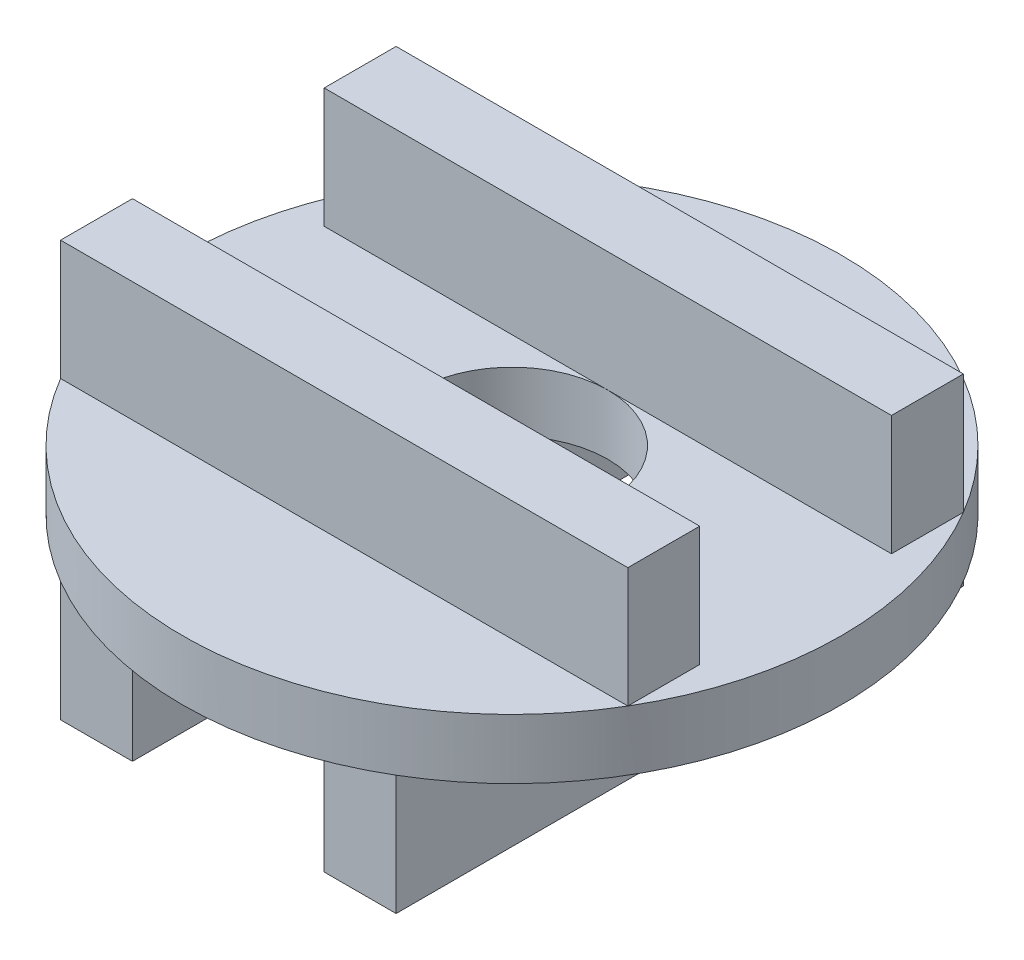
ISO-10303-21;
HEADER;
FILE_DESCRIPTION(('STEP AP214'),'2;1');
FILE_NAME('part.step','',(''),(''),'','','');
FILE_SCHEMA(('AUTOMOTIVE_DESIGN { 1 0 10303 214 1 1 1 1 }'));
ENDSEC;
DATA;
#1=APPLICATION_CONTEXT('core data for automotive mechanical design processes');
#2=APPLICATION_PROTOCOL_DEFINITION('international standard','automotive_design',2000,#1);
#3=PRODUCT_CONTEXT('',#1,'mechanical');
#4=PRODUCT('Part','Part','',(#3));
#5=PRODUCT_RELATED_PRODUCT_CATEGORY('part','',(#4));
#6=PRODUCT_DEFINITION_FORMATION('','',#4);
#7=PRODUCT_DEFINITION_CONTEXT('part definition',#1,'design');
#8=PRODUCT_DEFINITION('design','',#6,#7);
#9=PRODUCT_DEFINITION_SHAPE('','',#8);
#10=(LENGTH_UNIT() NAMED_UNIT(*) SI_UNIT(.MILLI.,.METRE.));
#11=(NAMED_UNIT(*) PLANE_ANGLE_UNIT() SI_UNIT($,.RADIAN.));
#12=(NAMED_UNIT(*) SI_UNIT($,.STERADIAN.) SOLID_ANGLE_UNIT());
#13=UNCERTAINTY_MEASURE_WITH_UNIT(LENGTH_MEASURE(1.E-05),#10,'distance_accuracy_value','');
#14=(GEOMETRIC_REPRESENTATION_CONTEXT(3) GLOBAL_UNCERTAINTY_ASSIGNED_CONTEXT((#13)) GLOBAL_UNIT_ASSIGNED_CONTEXT((#10,
#11,#12)) REPRESENTATION_CONTEXT('',''));
#15=CARTESIAN_POINT('',(0.,0.,0.));
#16=DIRECTION('',(0.,0.,1.));
#17=DIRECTION('',(1.,0.,0.));
#18=AXIS2_PLACEMENT_3D('',#15,#16,#17);
#19=CARTESIAN_POINT('',(0.,30.,-16.));
#20=DIRECTION('',(0.,0.,-1.));
#21=DIRECTION('',(-1.,0.,0.));
#22=AXIS2_PLACEMENT_3D('',#19,#20,#21);
#23=PLANE('',#22);
#24=DIRECTION('',(0.,-1.,0.));
#25=VECTOR('',#24,1.);
#26=CARTESIAN_POINT('',(-47.3392015141785,30.,-16.));
#27=LINE('',#26,#25);
#28=CARTESIAN_POINT('',(-47.3392015141785,30.,-16.));
#29=VERTEX_POINT('',#28);
#30=CARTESIAN_POINT('',(-47.3392015141785,10.,-16.));
#31=VERTEX_POINT('',#30);
#32=EDGE_CURVE('E352',#29,#31,#27,.T.);
#33=ORIENTED_EDGE('',*,*,#32,.T.);
#34=DIRECTION('',(1.,0.,0.));
#35=VECTOR('',#34,1.);
#36=CARTESIAN_POINT('',(0.,10.,-16.));
#37=LINE('',#36,#35);
#38=CARTESIAN_POINT('',(0.,10.,-16.));
#39=VERTEX_POINT('',#38);
#40=EDGE_CURVE('E387',#31,#39,#37,.T.);
#41=ORIENTED_EDGE('',*,*,#40,.T.);
#42=DIRECTION('',(1.,0.,0.));
#43=VECTOR('',#42,1.);
#44=CARTESIAN_POINT('',(0.,10.,-16.));
#45=LINE('',#44,#43);
#46=CARTESIAN_POINT('',(47.3392015141785,10.,-16.));
#47=VERTEX_POINT('',#46);
#48=EDGE_CURVE('E260',#39,#47,#45,.T.);
#49=ORIENTED_EDGE('',*,*,#48,.T.);
#50=DIRECTION('',(0.,-1.,0.));
#51=VECTOR('',#50,1.);
#52=CARTESIAN_POINT('',(47.3392015141785,30.,-16.));
#53=LINE('',#52,#51);
#54=CARTESIAN_POINT('',(47.3392015141785,30.,-16.));
#55=VERTEX_POINT('',#54);
#56=EDGE_CURVE('E79',#55,#47,#53,.T.);
#57=ORIENTED_EDGE('',*,*,#56,.F.);
#58=DIRECTION('',(1.,0.,0.));
#59=VECTOR('',#58,1.);
#60=CARTESIAN_POINT('',(0.,30.,-16.));
#61=LINE('',#60,#59);
#62=EDGE_CURVE('E331',#29,#55,#61,.T.);
#63=ORIENTED_EDGE('',*,*,#62,.F.);
#64=EDGE_LOOP('',(#33,#41,#49,#57,#63));
#65=FACE_BOUND('',#64,.T.);
#66=ADVANCED_FACE('F73',(#65),#23,.F.);
#67=CARTESIAN_POINT('',(0.,30.,16.));
#68=DIRECTION('',(0.,0.,-1.));
#69=DIRECTION('',(-1.,0.,0.));
#70=AXIS2_PLACEMENT_3D('',#67,#68,#69);
#71=PLANE('',#70);
#72=DIRECTION('',(1.,0.,0.));
#73=VECTOR('',#72,1.);
#74=CARTESIAN_POINT('',(0.,10.,16.));
#75=LINE('',#74,#73);
#76=CARTESIAN_POINT('',(-47.3392015141785,10.,16.));
#77=VERTEX_POINT('',#76);
#78=CARTESIAN_POINT('',(0.,10.,16.));
#79=VERTEX_POINT('',#78);
#80=EDGE_CURVE('E264',#77,#79,#75,.T.);
#81=ORIENTED_EDGE('',*,*,#80,.F.);
#82=DIRECTION('',(0.,-1.,0.));
#83=VECTOR('',#82,1.);
#84=CARTESIAN_POINT('',(-47.3392015141785,30.,16.));
#85=LINE('',#84,#83);
#86=CARTESIAN_POINT('',(-47.3392015141785,30.,16.));
#87=VERTEX_POINT('',#86);
#88=EDGE_CURVE('E313',#87,#77,#85,.T.);
#89=ORIENTED_EDGE('',*,*,#88,.F.);
#90=DIRECTION('',(1.,0.,0.));
#91=VECTOR('',#90,1.);
#92=CARTESIAN_POINT('',(0.,30.,16.));
#93=LINE('',#92,#91);
#94=CARTESIAN_POINT('',(47.3392015141785,30.,16.));
#95=VERTEX_POINT('',#94);
#96=EDGE_CURVE('E303',#87,#95,#93,.T.);
#97=ORIENTED_EDGE('',*,*,#96,.T.);
#98=DIRECTION('',(0.,-1.,0.));
#99=VECTOR('',#98,1.);
#100=CARTESIAN_POINT('',(47.3392015141785,30.,16.));
#101=LINE('',#100,#99);
#102=CARTESIAN_POINT('',(47.3392015141785,10.,16.));
#103=VERTEX_POINT('',#102);
#104=EDGE_CURVE('E235',#95,#103,#101,.T.);
#105=ORIENTED_EDGE('',*,*,#104,.T.);
#106=DIRECTION('',(1.,0.,0.));
#107=VECTOR('',#106,1.);
#108=CARTESIAN_POINT('',(0.,10.,16.));
#109=LINE('',#108,#107);
#110=EDGE_CURVE('E246',#79,#103,#109,.T.);
#111=ORIENTED_EDGE('',*,*,#110,.F.);
#112=EDGE_LOOP('',(#81,#89,#97,#105,#111));
#113=FACE_BOUND('',#112,.T.);
#114=ADVANCED_FACE('F408',(#113),#71,.T.);
#115=CARTESIAN_POINT('',(0.,0.,0.));
#116=DIRECTION('',(0.,1.,0.));
#117=DIRECTION('',(0.,0.,1.));
#118=AXIS2_PLACEMENT_3D('',#115,#116,#117);
#119=PLANE('',#118);
#120=CARTESIAN_POINT('',(0.,0.,0.));
#121=DIRECTION('',(0.,1.,0.));
#122=DIRECTION('',(0.,0.,1.));
#123=AXIS2_PLACEMENT_3D('',#120,#121,#122);
#124=CIRCLE('',#123,16.);
#125=CARTESIAN_POINT('',(16.,0.,0.));
#126=VERTEX_POINT('',#125);
#127=CARTESIAN_POINT('',(-16.,0.,0.));
#128=VERTEX_POINT('',#127);
#129=EDGE_CURVE('E253',#126,#128,#124,.T.);
#130=ORIENTED_EDGE('',*,*,#129,.T.);
#131=DIRECTION('',(0.,0.,-1.));
#132=VECTOR('',#131,1.);
#133=CARTESIAN_POINT('',(-16.,0.,0.));
#134=LINE('',#133,#132);
#135=CARTESIAN_POINT('',(-16.,0.,-47.3392015141785));
#136=VERTEX_POINT('',#135);
#137=EDGE_CURVE('E263',#128,#136,#134,.T.);
#138=ORIENTED_EDGE('',*,*,#137,.T.);
#139=DIRECTION('',(-1.,0.,0.));
#140=VECTOR('',#139,1.);
#141=CARTESIAN_POINT('',(0.,0.,-47.3392015141785));
#142=LINE('',#141,#140);
#143=CARTESIAN_POINT('',(-28.,0.,-47.3392015141785));
#144=VERTEX_POINT('',#143);
#145=EDGE_CURVE('E284',#136,#144,#142,.T.);
#146=ORIENTED_EDGE('',*,*,#145,.T.);
#147=CARTESIAN_POINT('',(0.,0.,0.));
#148=DIRECTION('',(0.,1.,0.));
#149=DIRECTION('',(0.,0.,1.));
#150=AXIS2_PLACEMENT_3D('',#147,#148,#149);
#151=CIRCLE('',#150,55.);
#152=CARTESIAN_POINT('',(28.,0.,-47.3392015141785));
#153=VERTEX_POINT('',#152);
#154=EDGE_CURVE('E376',#153,#144,#151,.T.);
#155=ORIENTED_EDGE('',*,*,#154,.F.);
#156=DIRECTION('',(1.,0.,0.));
#157=VECTOR('',#156,1.);
#158=CARTESIAN_POINT('',(0.,0.,-47.3392015141785));
#159=LINE('',#158,#157);
#160=CARTESIAN_POINT('',(16.,0.,-47.3392015141785));
#161=VERTEX_POINT('',#160);
#162=EDGE_CURVE('E231',#161,#153,#159,.T.);
#163=ORIENTED_EDGE('',*,*,#162,.F.);
#164=DIRECTION('',(0.,0.,-1.));
#165=VECTOR('',#164,1.);
#166=CARTESIAN_POINT('',(16.,0.,0.));
#167=LINE('',#166,#165);
#168=EDGE_CURVE('E85',#126,#161,#167,.T.);
#169=ORIENTED_EDGE('',*,*,#168,.F.);
#170=EDGE_LOOP('',(#130,#138,#146,#155,#163,#169));
#171=FACE_BOUND('',#170,.T.);
#172=ADVANCED_FACE('F372',(#171),#119,.F.);
#173=EDGE_CURVE('E250',#128,#126,#124,.T.);
#174=ORIENTED_EDGE('',*,*,#173,.T.);
#175=CARTESIAN_POINT('',(16.,0.,47.3392015141785));
#176=VERTEX_POINT('',#175);
#177=EDGE_CURVE('E330',#176,#126,#167,.T.);
#178=ORIENTED_EDGE('',*,*,#177,.F.);
#179=DIRECTION('',(1.,0.,0.));
#180=VECTOR('',#179,1.);
#181=CARTESIAN_POINT('',(0.,0.,47.3392015141785));
#182=LINE('',#181,#180);
#183=CARTESIAN_POINT('',(28.,0.,47.3392015141785));
#184=VERTEX_POINT('',#183);
#185=EDGE_CURVE('E320',#176,#184,#182,.T.);
#186=ORIENTED_EDGE('',*,*,#185,.T.);
#187=CARTESIAN_POINT('',(0.,0.,0.));
#188=DIRECTION('',(0.,1.,0.));
#189=DIRECTION('',(0.,0.,1.));
#190=AXIS2_PLACEMENT_3D('',#187,#188,#189);
#191=CIRCLE('',#190,55.);
#192=CARTESIAN_POINT('',(-28.,0.,47.3392015141785));
#193=VERTEX_POINT('',#192);
#194=EDGE_CURVE('E211',#193,#184,#191,.T.);
#195=ORIENTED_EDGE('',*,*,#194,.F.);
#196=DIRECTION('',(-1.,0.,0.));
#197=VECTOR('',#196,1.);
#198=CARTESIAN_POINT('',(0.,0.,47.3392015141785));
#199=LINE('',#198,#197);
#200=CARTESIAN_POINT('',(-16.,0.,47.3392015141785));
#201=VERTEX_POINT('',#200);
#202=EDGE_CURVE('E271',#201,#193,#199,.T.);
#203=ORIENTED_EDGE('',*,*,#202,.F.);
#204=EDGE_CURVE('E285',#201,#128,#134,.T.);
#205=ORIENTED_EDGE('',*,*,#204,.T.);
#206=EDGE_LOOP('',(#174,#178,#186,#195,#203,#205));
#207=FACE_BOUND('',#206,.T.);
#208=ADVANCED_FACE('F437',(#207),#119,.F.);
#209=DIRECTION('',(0.,0.,1.));
#210=VECTOR('',#209,1.);
#211=CARTESIAN_POINT('',(28.,0.,0.));
#212=LINE('',#211,#210);
#213=EDGE_CURVE('E12',#153,#184,#212,.T.);
#214=ORIENTED_EDGE('',*,*,#213,.F.);
#215=CARTESIAN_POINT('',(0.,0.,0.));
#216=DIRECTION('',(0.,1.,0.));
#217=DIRECTION('',(0.,0.,1.));
#218=AXIS2_PLACEMENT_3D('',#215,#216,#217);
#219=CIRCLE('',#218,55.);
#220=EDGE_CURVE('E262',#184,#153,#219,.T.);
#221=ORIENTED_EDGE('',*,*,#220,.F.);
#222=EDGE_LOOP('',(#214,#221));
#223=FACE_BOUND('',#222,.T.);
#224=ADVANCED_FACE('F434',(#223),#119,.F.);
#225=CARTESIAN_POINT('',(0.,0.,0.));
#226=DIRECTION('',(0.,1.,0.));
#227=DIRECTION('',(0.,0.,1.));
#228=AXIS2_PLACEMENT_3D('',#225,#226,#227);
#229=CIRCLE('',#228,55.);
#230=EDGE_CURVE('E382',#144,#193,#229,.T.);
#231=ORIENTED_EDGE('',*,*,#230,.F.);
#232=DIRECTION('',(0.,0.,1.));
#233=VECTOR('',#232,1.);
#234=CARTESIAN_POINT('',(-28.,0.,0.));
#235=LINE('',#234,#233);
#236=EDGE_CURVE('E289',#144,#193,#235,.T.);
#237=ORIENTED_EDGE('',*,*,#236,.T.);
#238=EDGE_LOOP('',(#231,#237));
#239=FACE_BOUND('',#238,.T.);
#240=ADVANCED_FACE('F433',(#239),#119,.F.);
#241=CARTESIAN_POINT('',(47.3392015141785,30.,0.));
#242=DIRECTION('',(-1.,0.,0.));
#243=DIRECTION('',(0.,0.,1.));
#244=AXIS2_PLACEMENT_3D('',#241,#242,#243);
#245=PLANE('',#244);
#246=ORIENTED_EDGE('',*,*,#56,.T.);
#247=DIRECTION('',(0.,0.,-1.));
#248=VECTOR('',#247,1.);
#249=CARTESIAN_POINT('',(47.3392015141785,10.,0.));
#250=LINE('',#249,#248);
#251=CARTESIAN_POINT('',(47.3392015141785,10.,-28.));
#252=VERTEX_POINT('',#251);
#253=EDGE_CURVE('E244',#47,#252,#250,.T.);
#254=ORIENTED_EDGE('',*,*,#253,.T.);
#255=DIRECTION('',(0.,-1.,0.));
#256=VECTOR('',#255,1.);
#257=CARTESIAN_POINT('',(47.3392015141785,30.,-28.));
#258=LINE('',#257,#256);
#259=CARTESIAN_POINT('',(47.3392015141785,30.,-28.));
#260=VERTEX_POINT('',#259);
#261=EDGE_CURVE('E351',#260,#252,#258,.T.);
#262=ORIENTED_EDGE('',*,*,#261,.F.);
#263=DIRECTION('',(0.,0.,-1.));
#264=VECTOR('',#263,1.);
#265=CARTESIAN_POINT('',(47.3392015141785,30.,0.));
#266=LINE('',#265,#264);
#267=EDGE_CURVE('E342',#55,#260,#266,.T.);
#268=ORIENTED_EDGE('',*,*,#267,.F.);
#269=EDGE_LOOP('',(#246,#254,#262,#268));
#270=FACE_BOUND('',#269,.T.);
#271=ADVANCED_FACE('F426',(#270),#245,.F.);
#272=CARTESIAN_POINT('',(0.,30.,-28.));
#273=DIRECTION('',(0.,0.,1.));
#274=DIRECTION('',(1.,0.,0.));
#275=AXIS2_PLACEMENT_3D('',#272,#273,#274);
#276=PLANE('',#275);
#277=ORIENTED_EDGE('',*,*,#261,.T.);
#278=DIRECTION('',(-1.,0.,0.));
#279=VECTOR('',#278,1.);
#280=CARTESIAN_POINT('',(0.,10.,-28.));
#281=LINE('',#280,#279);
#282=CARTESIAN_POINT('',(-47.3392015141785,10.,-28.));
#283=VERTEX_POINT('',#282);
#284=EDGE_CURVE('E93',#252,#283,#281,.T.);
#285=ORIENTED_EDGE('',*,*,#284,.T.);
#286=DIRECTION('',(0.,-1.,0.));
#287=VECTOR('',#286,1.);
#288=CARTESIAN_POINT('',(-47.3392015141785,30.,-28.));
#289=LINE('',#288,#287);
#290=CARTESIAN_POINT('',(-47.3392015141785,30.,-28.));
#291=VERTEX_POINT('',#290);
#292=EDGE_CURVE('E354',#291,#283,#289,.T.);
#293=ORIENTED_EDGE('',*,*,#292,.F.);
#294=DIRECTION('',(-1.,0.,0.));
#295=VECTOR('',#294,1.);
#296=CARTESIAN_POINT('',(0.,30.,-28.));
#297=LINE('',#296,#295);
#298=EDGE_CURVE('E350',#260,#291,#297,.T.);
#299=ORIENTED_EDGE('',*,*,#298,.F.);
#300=EDGE_LOOP('',(#277,#285,#293,#299));
#301=FACE_BOUND('',#300,.T.);
#302=ADVANCED_FACE('F424',(#301),#276,.F.);
#303=CARTESIAN_POINT('',(-47.3392015141785,30.,0.));
#304=DIRECTION('',(1.,0.,0.));
#305=DIRECTION('',(0.,0.,-1.));
#306=AXIS2_PLACEMENT_3D('',#303,#304,#305);
#307=PLANE('',#306);
#308=ORIENTED_EDGE('',*,*,#292,.T.);
#309=DIRECTION('',(0.,0.,1.));
#310=VECTOR('',#309,1.);
#311=CARTESIAN_POINT('',(-47.3392015141785,10.,0.));
#312=LINE('',#311,#310);
#313=EDGE_CURVE('E98',#283,#31,#312,.T.);
#314=ORIENTED_EDGE('',*,*,#313,.T.);
#315=ORIENTED_EDGE('',*,*,#32,.F.);
#316=DIRECTION('',(0.,0.,1.));
#317=VECTOR('',#316,1.);
#318=CARTESIAN_POINT('',(-47.3392015141785,30.,0.));
#319=LINE('',#318,#317);
#320=EDGE_CURVE('E349',#291,#29,#319,.T.);
#321=ORIENTED_EDGE('',*,*,#320,.F.);
#322=EDGE_LOOP('',(#308,#314,#315,#321));
#323=FACE_BOUND('',#322,.T.);
#324=ADVANCED_FACE('F423',(#323),#307,.F.);
#325=CARTESIAN_POINT('',(0.,30.,0.));
#326=DIRECTION('',(0.,1.,0.));
#327=DIRECTION('',(0.,0.,1.));
#328=AXIS2_PLACEMENT_3D('',#325,#326,#327);
#329=PLANE('',#328);
#330=ORIENTED_EDGE('',*,*,#62,.T.);
#331=ORIENTED_EDGE('',*,*,#267,.T.);
#332=ORIENTED_EDGE('',*,*,#298,.T.);
#333=ORIENTED_EDGE('',*,*,#320,.T.);
#334=EDGE_LOOP('',(#330,#331,#332,#333));
#335=FACE_BOUND('',#334,.T.);
#336=ADVANCED_FACE('F421',(#335),#329,.T.);
#337=CARTESIAN_POINT('',(28.,-20.,0.));
#338=DIRECTION('',(-1.,0.,0.));
#339=DIRECTION('',(0.,0.,1.));
#340=AXIS2_PLACEMENT_3D('',#337,#338,#339);
#341=PLANE('',#340);
#342=DIRECTION('',(0.,1.,0.));
#343=VECTOR('',#342,1.);
#344=CARTESIAN_POINT('',(28.,-20.,-47.3392015141785));
#345=LINE('',#344,#343);
#346=CARTESIAN_POINT('',(28.,-20.,-47.3392015141785));
#347=VERTEX_POINT('',#346);
#348=EDGE_CURVE('E323',#347,#153,#345,.T.);
#349=ORIENTED_EDGE('',*,*,#348,.T.);
#350=ORIENTED_EDGE('',*,*,#213,.T.);
#351=DIRECTION('',(0.,1.,0.));
#352=VECTOR('',#351,1.);
#353=CARTESIAN_POINT('',(28.,-20.,47.3392015141785));
#354=LINE('',#353,#352);
#355=CARTESIAN_POINT('',(28.,-20.,47.3392015141785));
#356=VERTEX_POINT('',#355);
#357=EDGE_CURVE('E332',#356,#184,#354,.T.);
#358=ORIENTED_EDGE('',*,*,#357,.F.);
#359=DIRECTION('',(0.,0.,1.));
#360=VECTOR('',#359,1.);
#361=CARTESIAN_POINT('',(28.,-20.,0.));
#362=LINE('',#361,#360);
#363=EDGE_CURVE('E314',#347,#356,#362,.T.);
#364=ORIENTED_EDGE('',*,*,#363,.F.);
#365=EDGE_LOOP('',(#349,#350,#358,#364));
#366=FACE_BOUND('',#365,.T.);
#367=ADVANCED_FACE('F445',(#366),#341,.F.);
#368=CARTESIAN_POINT('',(0.,-20.,47.3392015141785));
#369=DIRECTION('',(0.,0.,1.));
#370=DIRECTION('',(1.,0.,0.));
#371=AXIS2_PLACEMENT_3D('',#368,#369,#370);
#372=PLANE('',#371);
#373=ORIENTED_EDGE('',*,*,#185,.F.);
#374=DIRECTION('',(0.,1.,0.));
#375=VECTOR('',#374,1.);
#376=CARTESIAN_POINT('',(16.,-20.,47.3392015141785));
#377=LINE('',#376,#375);
#378=CARTESIAN_POINT('',(16.,-20.,47.3392015141785));
#379=VERTEX_POINT('',#378);
#380=EDGE_CURVE('E333',#379,#176,#377,.T.);
#381=ORIENTED_EDGE('',*,*,#380,.F.);
#382=DIRECTION('',(1.,0.,0.));
#383=VECTOR('',#382,1.);
#384=CARTESIAN_POINT('',(0.,-20.,47.3392015141785));
#385=LINE('',#384,#383);
#386=EDGE_CURVE('E321',#379,#356,#385,.T.);
#387=ORIENTED_EDGE('',*,*,#386,.T.);
#388=ORIENTED_EDGE('',*,*,#357,.T.);
#389=EDGE_LOOP('',(#373,#381,#387,#388));
#390=FACE_BOUND('',#389,.T.);
#391=ADVANCED_FACE('F443',(#390),#372,.T.);
#392=CARTESIAN_POINT('',(16.,-20.,0.));
#393=DIRECTION('',(1.,0.,0.));
#394=DIRECTION('',(0.,0.,-1.));
#395=AXIS2_PLACEMENT_3D('',#392,#393,#394);
#396=PLANE('',#395);
#397=ORIENTED_EDGE('',*,*,#177,.T.);
#398=ORIENTED_EDGE('',*,*,#168,.T.);
#399=DIRECTION('',(0.,1.,0.));
#400=VECTOR('',#399,1.);
#401=CARTESIAN_POINT('',(16.,-20.,-47.3392015141785));
#402=LINE('',#401,#400);
#403=CARTESIAN_POINT('',(16.,-20.,-47.3392015141785));
#404=VERTEX_POINT('',#403);
#405=EDGE_CURVE('E339',#404,#161,#402,.T.);
#406=ORIENTED_EDGE('',*,*,#405,.F.);
#407=DIRECTION('',(0.,0.,-1.));
#408=VECTOR('',#407,1.);
#409=CARTESIAN_POINT('',(16.,-20.,0.));
#410=LINE('',#409,#408);
#411=EDGE_CURVE('E317',#379,#404,#410,.T.);
#412=ORIENTED_EDGE('',*,*,#411,.F.);
#413=ORIENTED_EDGE('',*,*,#380,.T.);
#414=EDGE_LOOP('',(#397,#398,#406,#412,#413));
#415=FACE_BOUND('',#414,.T.);
#416=ADVANCED_FACE('F361',(#415),#396,.F.);
#417=CARTESIAN_POINT('',(0.,-20.,-47.3392015141785));
#418=DIRECTION('',(0.,0.,1.));
#419=DIRECTION('',(1.,0.,0.));
#420=AXIS2_PLACEMENT_3D('',#417,#418,#419);
#421=PLANE('',#420);
#422=ORIENTED_EDGE('',*,*,#162,.T.);
#423=ORIENTED_EDGE('',*,*,#348,.F.);
#424=DIRECTION('',(1.,0.,0.));
#425=VECTOR('',#424,1.);
#426=CARTESIAN_POINT('',(0.,-20.,-47.3392015141785));
#427=LINE('',#426,#425);
#428=EDGE_CURVE('E316',#404,#347,#427,.T.);
#429=ORIENTED_EDGE('',*,*,#428,.F.);
#430=ORIENTED_EDGE('',*,*,#405,.T.);
#431=EDGE_LOOP('',(#422,#423,#429,#430));
#432=FACE_BOUND('',#431,.T.);
#433=ADVANCED_FACE('F371',(#432),#421,.F.);
#434=CARTESIAN_POINT('',(0.,-20.,0.));
#435=DIRECTION('',(0.,1.,0.));
#436=DIRECTION('',(0.,0.,1.));
#437=AXIS2_PLACEMENT_3D('',#434,#435,#436);
#438=PLANE('',#437);
#439=ORIENTED_EDGE('',*,*,#363,.T.);
#440=ORIENTED_EDGE('',*,*,#386,.F.);
#441=ORIENTED_EDGE('',*,*,#411,.T.);
#442=ORIENTED_EDGE('',*,*,#428,.T.);
#443=EDGE_LOOP('',(#439,#440,#441,#442));
#444=FACE_BOUND('',#443,.T.);
#445=ADVANCED_FACE('F446',(#444),#438,.F.);
#446=CARTESIAN_POINT('',(0.,30.,28.));
#447=DIRECTION('',(0.,0.,1.));
#448=DIRECTION('',(1.,0.,0.));
#449=AXIS2_PLACEMENT_3D('',#446,#447,#448);
#450=PLANE('',#449);
#451=DIRECTION('',(-1.,0.,0.));
#452=VECTOR('',#451,1.);
#453=CARTESIAN_POINT('',(0.,10.,28.));
#454=LINE('',#453,#452);
#455=CARTESIAN_POINT('',(47.3392015141785,10.,28.));
#456=VERTEX_POINT('',#455);
#457=CARTESIAN_POINT('',(-47.3392015141785,10.,28.));
#458=VERTEX_POINT('',#457);
#459=EDGE_CURVE('E206',#456,#458,#454,.T.);
#460=ORIENTED_EDGE('',*,*,#459,.F.);
#461=DIRECTION('',(0.,-1.,0.));
#462=VECTOR('',#461,1.);
#463=CARTESIAN_POINT('',(47.3392015141785,30.,28.));
#464=LINE('',#463,#462);
#465=CARTESIAN_POINT('',(47.3392015141785,30.,28.));
#466=VERTEX_POINT('',#465);
#467=EDGE_CURVE('E217',#466,#456,#464,.T.);
#468=ORIENTED_EDGE('',*,*,#467,.F.);
#469=DIRECTION('',(-1.,0.,0.));
#470=VECTOR('',#469,1.);
#471=CARTESIAN_POINT('',(0.,30.,28.));
#472=LINE('',#471,#470);
#473=CARTESIAN_POINT('',(-47.3392015141785,30.,28.));
#474=VERTEX_POINT('',#473);
#475=EDGE_CURVE('E294',#466,#474,#472,.T.);
#476=ORIENTED_EDGE('',*,*,#475,.T.);
#477=DIRECTION('',(0.,-1.,0.));
#478=VECTOR('',#477,1.);
#479=CARTESIAN_POINT('',(-47.3392015141785,30.,28.));
#480=LINE('',#479,#478);
#481=EDGE_CURVE('E219',#474,#458,#480,.T.);
#482=ORIENTED_EDGE('',*,*,#481,.T.);
#483=EDGE_LOOP('',(#460,#468,#476,#482));
#484=FACE_BOUND('',#483,.T.);
#485=ADVANCED_FACE('F216',(#484),#450,.T.);
#486=CARTESIAN_POINT('',(47.3392015141785,30.,0.));
#487=DIRECTION('',(1.,0.,0.));
#488=DIRECTION('',(0.,0.,-1.));
#489=AXIS2_PLACEMENT_3D('',#486,#487,#488);
#490=PLANE('',#489);
#491=DIRECTION('',(0.,0.,1.));
#492=VECTOR('',#491,1.);
#493=CARTESIAN_POINT('',(47.3392015141785,10.,0.));
#494=LINE('',#493,#492);
#495=EDGE_CURVE('E229',#103,#456,#494,.T.);
#496=ORIENTED_EDGE('',*,*,#495,.F.);
#497=ORIENTED_EDGE('',*,*,#104,.F.);
#498=DIRECTION('',(0.,0.,1.));
#499=VECTOR('',#498,1.);
#500=CARTESIAN_POINT('',(47.3392015141785,30.,0.));
#501=LINE('',#500,#499);
#502=EDGE_CURVE('E234',#95,#466,#501,.T.);
#503=ORIENTED_EDGE('',*,*,#502,.T.);
#504=ORIENTED_EDGE('',*,*,#467,.T.);
#505=EDGE_LOOP('',(#496,#497,#503,#504));
#506=FACE_BOUND('',#505,.T.);
#507=ADVANCED_FACE('F227',(#506),#490,.T.);
#508=CARTESIAN_POINT('',(-47.3392015141785,30.,0.));
#509=DIRECTION('',(-1.,0.,0.));
#510=DIRECTION('',(0.,0.,1.));
#511=AXIS2_PLACEMENT_3D('',#508,#509,#510);
#512=PLANE('',#511);
#513=DIRECTION('',(0.,0.,-1.));
#514=VECTOR('',#513,1.);
#515=CARTESIAN_POINT('',(-47.3392015141785,10.,0.));
#516=LINE('',#515,#514);
#517=EDGE_CURVE('E394',#458,#77,#516,.T.);
#518=ORIENTED_EDGE('',*,*,#517,.F.);
#519=ORIENTED_EDGE('',*,*,#481,.F.);
#520=DIRECTION('',(0.,0.,-1.));
#521=VECTOR('',#520,1.);
#522=CARTESIAN_POINT('',(-47.3392015141785,30.,0.));
#523=LINE('',#522,#521);
#524=EDGE_CURVE('E307',#474,#87,#523,.T.);
#525=ORIENTED_EDGE('',*,*,#524,.T.);
#526=ORIENTED_EDGE('',*,*,#88,.T.);
#527=EDGE_LOOP('',(#518,#519,#525,#526));
#528=FACE_BOUND('',#527,.T.);
#529=ADVANCED_FACE('F462',(#528),#512,.T.);
#530=CARTESIAN_POINT('',(0.,30.,0.));
#531=DIRECTION('',(0.,1.,0.));
#532=DIRECTION('',(0.,0.,1.));
#533=AXIS2_PLACEMENT_3D('',#530,#531,#532);
#534=PLANE('',#533);
#535=ORIENTED_EDGE('',*,*,#475,.F.);
#536=ORIENTED_EDGE('',*,*,#502,.F.);
#537=ORIENTED_EDGE('',*,*,#96,.F.);
#538=ORIENTED_EDGE('',*,*,#524,.F.);
#539=EDGE_LOOP('',(#535,#536,#537,#538));
#540=FACE_BOUND('',#539,.T.);
#541=ADVANCED_FACE('F463',(#540),#534,.T.);
#542=CARTESIAN_POINT('',(-16.,-20.,0.));
#543=DIRECTION('',(1.,0.,0.));
#544=DIRECTION('',(0.,0.,-1.));
#545=AXIS2_PLACEMENT_3D('',#542,#543,#544);
#546=PLANE('',#545);
#547=ORIENTED_EDGE('',*,*,#204,.F.);
#548=DIRECTION('',(0.,1.,0.));
#549=VECTOR('',#548,1.);
#550=CARTESIAN_POINT('',(-16.,-20.,47.3392015141785));
#551=LINE('',#550,#549);
#552=CARTESIAN_POINT('',(-16.,-20.,47.3392015141785));
#553=VERTEX_POINT('',#552);
#554=EDGE_CURVE('E292',#553,#201,#551,.T.);
#555=ORIENTED_EDGE('',*,*,#554,.F.);
#556=DIRECTION('',(0.,0.,-1.));
#557=VECTOR('',#556,1.);
#558=CARTESIAN_POINT('',(-16.,-20.,0.));
#559=LINE('',#558,#557);
#560=CARTESIAN_POINT('',(-16.,-20.,-47.3392015141785));
#561=VERTEX_POINT('',#560);
#562=EDGE_CURVE('E270',#553,#561,#559,.T.);
#563=ORIENTED_EDGE('',*,*,#562,.T.);
#564=DIRECTION('',(0.,1.,0.));
#565=VECTOR('',#564,1.);
#566=CARTESIAN_POINT('',(-16.,-20.,-47.3392015141785));
#567=LINE('',#566,#565);
#568=EDGE_CURVE('E276',#561,#136,#567,.T.);
#569=ORIENTED_EDGE('',*,*,#568,.T.);
#570=ORIENTED_EDGE('',*,*,#137,.F.);
#571=EDGE_LOOP('',(#547,#555,#563,#569,#570));
#572=FACE_BOUND('',#571,.T.);
#573=ADVANCED_FACE('F468',(#572),#546,.T.);
#574=CARTESIAN_POINT('',(0.,-20.,47.3392015141785));
#575=DIRECTION('',(0.,0.,-1.));
#576=DIRECTION('',(-1.,0.,0.));
#577=AXIS2_PLACEMENT_3D('',#574,#575,#576);
#578=PLANE('',#577);
#579=ORIENTED_EDGE('',*,*,#202,.T.);
#580=DIRECTION('',(0.,1.,0.));
#581=VECTOR('',#580,1.);
#582=CARTESIAN_POINT('',(-28.,-20.,47.3392015141785));
#583=LINE('',#582,#581);
#584=CARTESIAN_POINT('',(-28.,-20.,47.3392015141785));
#585=VERTEX_POINT('',#584);
#586=EDGE_CURVE('E293',#585,#193,#583,.T.);
#587=ORIENTED_EDGE('',*,*,#586,.F.);
#588=DIRECTION('',(-1.,0.,0.));
#589=VECTOR('',#588,1.);
#590=CARTESIAN_POINT('',(0.,-20.,47.3392015141785));
#591=LINE('',#590,#589);
#592=EDGE_CURVE('E280',#553,#585,#591,.T.);
#593=ORIENTED_EDGE('',*,*,#592,.F.);
#594=ORIENTED_EDGE('',*,*,#554,.T.);
#595=EDGE_LOOP('',(#579,#587,#593,#594));
#596=FACE_BOUND('',#595,.T.);
#597=ADVANCED_FACE('F471',(#596),#578,.F.);
#598=CARTESIAN_POINT('',(-28.,-20.,0.));
#599=DIRECTION('',(-1.,0.,0.));
#600=DIRECTION('',(0.,0.,1.));
#601=AXIS2_PLACEMENT_3D('',#598,#599,#600);
#602=PLANE('',#601);
#603=ORIENTED_EDGE('',*,*,#236,.F.);
#604=DIRECTION('',(0.,1.,0.));
#605=VECTOR('',#604,1.);
#606=CARTESIAN_POINT('',(-28.,-20.,-47.3392015141785));
#607=LINE('',#606,#605);
#608=CARTESIAN_POINT('',(-28.,-20.,-47.3392015141785));
#609=VERTEX_POINT('',#608);
#610=EDGE_CURVE('E299',#609,#144,#607,.T.);
#611=ORIENTED_EDGE('',*,*,#610,.F.);
#612=DIRECTION('',(0.,0.,1.));
#613=VECTOR('',#612,1.);
#614=CARTESIAN_POINT('',(-28.,-20.,0.));
#615=LINE('',#614,#613);
#616=EDGE_CURVE('E273',#609,#585,#615,.T.);
#617=ORIENTED_EDGE('',*,*,#616,.T.);
#618=ORIENTED_EDGE('',*,*,#586,.T.);
#619=EDGE_LOOP('',(#603,#611,#617,#618));
#620=FACE_BOUND('',#619,.T.);
#621=ADVANCED_FACE('F479',(#620),#602,.T.);
#622=CARTESIAN_POINT('',(0.,-20.,-47.3392015141785));
#623=DIRECTION('',(0.,0.,-1.));
#624=DIRECTION('',(-1.,0.,0.));
#625=AXIS2_PLACEMENT_3D('',#622,#623,#624);
#626=PLANE('',#625);
#627=ORIENTED_EDGE('',*,*,#145,.F.);
#628=ORIENTED_EDGE('',*,*,#568,.F.);
#629=DIRECTION('',(-1.,0.,0.));
#630=VECTOR('',#629,1.);
#631=CARTESIAN_POINT('',(0.,-20.,-47.3392015141785));
#632=LINE('',#631,#630);
#633=EDGE_CURVE('E269',#561,#609,#632,.T.);
#634=ORIENTED_EDGE('',*,*,#633,.T.);
#635=ORIENTED_EDGE('',*,*,#610,.T.);
#636=EDGE_LOOP('',(#627,#628,#634,#635));
#637=FACE_BOUND('',#636,.T.);
#638=ADVANCED_FACE('F474',(#637),#626,.T.);
#639=CARTESIAN_POINT('',(0.,-20.,0.));
#640=DIRECTION('',(0.,1.,0.));
#641=DIRECTION('',(0.,0.,1.));
#642=AXIS2_PLACEMENT_3D('',#639,#640,#641);
#643=PLANE('',#642);
#644=ORIENTED_EDGE('',*,*,#562,.F.);
#645=ORIENTED_EDGE('',*,*,#592,.T.);
#646=ORIENTED_EDGE('',*,*,#616,.F.);
#647=ORIENTED_EDGE('',*,*,#633,.F.);
#648=EDGE_LOOP('',(#644,#645,#646,#647));
#649=FACE_BOUND('',#648,.T.);
#650=ADVANCED_FACE('F476',(#649),#643,.F.);
#651=CARTESIAN_POINT('',(0.,10.,0.));
#652=DIRECTION('',(0.,-1.,0.));
#653=DIRECTION('',(0.,0.,-1.));
#654=AXIS2_PLACEMENT_3D('',#651,#652,#653);
#655=CYLINDRICAL_SURFACE('',#654,55.);
#656=ORIENTED_EDGE('',*,*,#230,.T.);
#657=ORIENTED_EDGE('',*,*,#194,.T.);
#658=ORIENTED_EDGE('',*,*,#220,.T.);
#659=ORIENTED_EDGE('',*,*,#154,.T.);
#660=EDGE_LOOP('',(#656,#657,#658,#659));
#661=FACE_BOUND('',#660,.T.);
#662=CARTESIAN_POINT('',(0.,10.,0.));
#663=DIRECTION('',(0.,1.,0.));
#664=DIRECTION('',(0.,0.,1.));
#665=AXIS2_PLACEMENT_3D('',#662,#663,#664);
#666=CIRCLE('',#665,55.);
#667=EDGE_CURVE('E201',#458,#456,#666,.T.);
#668=ORIENTED_EDGE('',*,*,#667,.F.);
#669=CARTESIAN_POINT('',(0.,10.,0.));
#670=DIRECTION('',(0.,1.,0.));
#671=DIRECTION('',(0.,0.,1.));
#672=AXIS2_PLACEMENT_3D('',#669,#670,#671);
#673=CIRCLE('',#672,55.);
#674=EDGE_CURVE('E389',#283,#458,#673,.T.);
#675=ORIENTED_EDGE('',*,*,#674,.F.);
#676=CARTESIAN_POINT('',(0.,10.,0.));
#677=DIRECTION('',(0.,1.,0.));
#678=DIRECTION('',(0.,0.,1.));
#679=AXIS2_PLACEMENT_3D('',#676,#677,#678);
#680=CIRCLE('',#679,55.);
#681=EDGE_CURVE('E238',#252,#283,#680,.T.);
#682=ORIENTED_EDGE('',*,*,#681,.F.);
#683=CARTESIAN_POINT('',(0.,10.,0.));
#684=DIRECTION('',(0.,1.,0.));
#685=DIRECTION('',(0.,0.,1.));
#686=AXIS2_PLACEMENT_3D('',#683,#684,#685);
#687=CIRCLE('',#686,55.);
#688=EDGE_CURVE('E240',#456,#252,#687,.T.);
#689=ORIENTED_EDGE('',*,*,#688,.F.);
#690=EDGE_LOOP('',(#668,#675,#682,#689));
#691=FACE_BOUND('',#690,.T.);
#692=ADVANCED_FACE('F236',(#661,#691),#655,.T.);
#693=CARTESIAN_POINT('',(0.,10.,0.));
#694=DIRECTION('',(0.,-1.,0.));
#695=DIRECTION('',(0.,0.,-1.));
#696=AXIS2_PLACEMENT_3D('',#693,#694,#695);
#697=CYLINDRICAL_SURFACE('',#696,16.);
#698=ORIENTED_EDGE('',*,*,#173,.F.);
#699=ORIENTED_EDGE('',*,*,#129,.F.);
#700=EDGE_LOOP('',(#698,#699));
#701=FACE_BOUND('',#700,.T.);
#702=CARTESIAN_POINT('',(0.,10.,0.));
#703=DIRECTION('',(0.,1.,0.));
#704=DIRECTION('',(0.,0.,1.));
#705=AXIS2_PLACEMENT_3D('',#702,#703,#704);
#706=CIRCLE('',#705,16.);
#707=EDGE_CURVE('E259',#79,#39,#706,.T.);
#708=ORIENTED_EDGE('',*,*,#707,.T.);
#709=CARTESIAN_POINT('',(0.,10.,0.));
#710=DIRECTION('',(0.,1.,0.));
#711=DIRECTION('',(0.,0.,1.));
#712=AXIS2_PLACEMENT_3D('',#709,#710,#711);
#713=CIRCLE('',#712,16.);
#714=EDGE_CURVE('E384',#39,#79,#713,.T.);
#715=ORIENTED_EDGE('',*,*,#714,.T.);
#716=EDGE_LOOP('',(#708,#715));
#717=FACE_BOUND('',#716,.T.);
#718=ADVANCED_FACE('F491',(#701,#717),#697,.F.);
#719=CARTESIAN_POINT('',(0.,10.,0.));
#720=DIRECTION('',(0.,1.,0.));
#721=DIRECTION('',(0.,0.,1.));
#722=AXIS2_PLACEMENT_3D('',#719,#720,#721);
#723=PLANE('',#722);
#724=ORIENTED_EDGE('',*,*,#495,.T.);
#725=ORIENTED_EDGE('',*,*,#688,.T.);
#726=ORIENTED_EDGE('',*,*,#253,.F.);
#727=ORIENTED_EDGE('',*,*,#48,.F.);
#728=ORIENTED_EDGE('',*,*,#707,.F.);
#729=ORIENTED_EDGE('',*,*,#110,.T.);
#730=EDGE_LOOP('',(#724,#725,#726,#727,#728,#729));
#731=FACE_BOUND('',#730,.T.);
#732=ADVANCED_FACE('F243',(#731),#723,.T.);
#733=CARTESIAN_POINT('',(0.,10.,0.));
#734=DIRECTION('',(0.,1.,0.));
#735=DIRECTION('',(0.,0.,1.));
#736=AXIS2_PLACEMENT_3D('',#733,#734,#735);
#737=PLANE('',#736);
#738=ORIENTED_EDGE('',*,*,#313,.F.);
#739=ORIENTED_EDGE('',*,*,#674,.T.);
#740=ORIENTED_EDGE('',*,*,#517,.T.);
#741=ORIENTED_EDGE('',*,*,#80,.T.);
#742=ORIENTED_EDGE('',*,*,#714,.F.);
#743=ORIENTED_EDGE('',*,*,#40,.F.);
#744=EDGE_LOOP('',(#738,#739,#740,#741,#742,#743));
#745=FACE_BOUND('',#744,.T.);
#746=ADVANCED_FACE('F399',(#745),#737,.T.);
#747=CARTESIAN_POINT('',(0.,10.,0.));
#748=DIRECTION('',(0.,1.,0.));
#749=DIRECTION('',(0.,0.,1.));
#750=AXIS2_PLACEMENT_3D('',#747,#748,#749);
#751=PLANE('',#750);
#752=ORIENTED_EDGE('',*,*,#284,.F.);
#753=ORIENTED_EDGE('',*,*,#681,.T.);
#754=EDGE_LOOP('',(#752,#753));
#755=FACE_BOUND('',#754,.T.);
#756=ADVANCED_FACE('F397',(#755),#751,.T.);
#757=CARTESIAN_POINT('',(0.,10.,0.));
#758=DIRECTION('',(0.,1.,0.));
#759=DIRECTION('',(0.,0.,1.));
#760=AXIS2_PLACEMENT_3D('',#757,#758,#759);
#761=PLANE('',#760);
#762=ORIENTED_EDGE('',*,*,#667,.T.);
#763=ORIENTED_EDGE('',*,*,#459,.T.);
#764=EDGE_LOOP('',(#762,#763));
#765=FACE_BOUND('',#764,.T.);
#766=ADVANCED_FACE('F202',(#765),#761,.T.);
#767=CLOSED_SHELL('',(#66,#114,#172,#208,#224,#240,#271,#302,#324,#336,#367,#391,#416,#433,#445,
#485,#507,#529,#541,#573,#597,#621,#638,#650,#692,#718,#732,#746,#756,#766));
#768=MANIFOLD_SOLID_BREP('B2',#767);
#769=ADVANCED_BREP_SHAPE_REPRESENTATION('',(#18,#768),#14);
#770=SHAPE_DEFINITION_REPRESENTATION(#9,#769);
ENDSEC;
END-ISO-10303-21;
